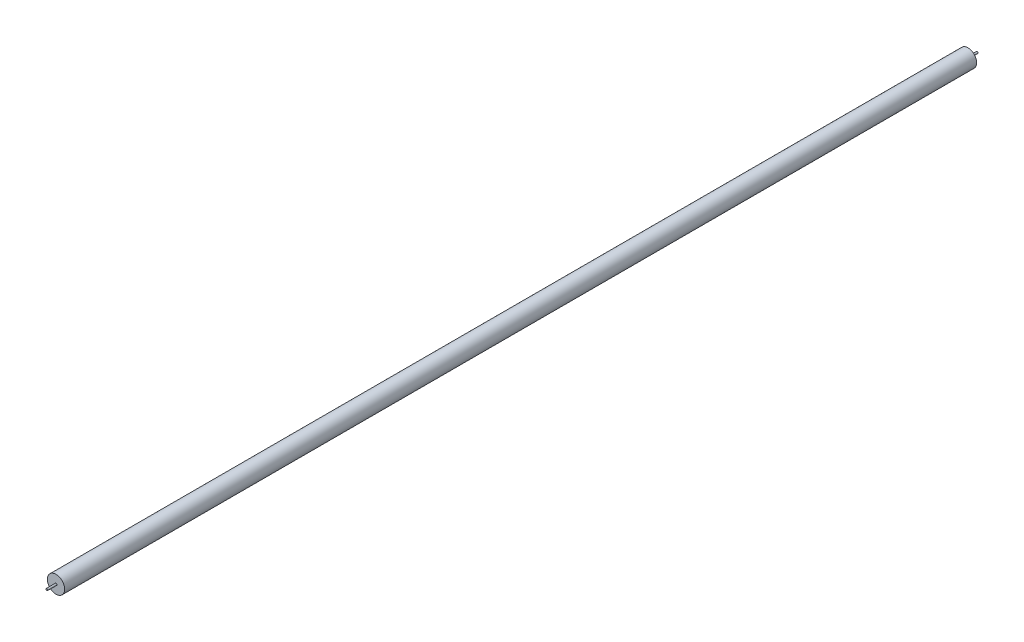
ISO-10303-21;
HEADER;
FILE_DESCRIPTION(('STEP AP214'),'2;1');
FILE_NAME('part.step','',(''),(''),'','','');
FILE_SCHEMA(('AUTOMOTIVE_DESIGN { 1 0 10303 214 1 1 1 1 }'));
ENDSEC;
DATA;
#1=APPLICATION_CONTEXT('core data for automotive mechanical design processes');
#2=APPLICATION_PROTOCOL_DEFINITION('international standard','automotive_design',2000,#1);
#3=PRODUCT_CONTEXT('',#1,'mechanical');
#4=PRODUCT('Part','Part','',(#3));
#5=PRODUCT_RELATED_PRODUCT_CATEGORY('part','',(#4));
#6=PRODUCT_DEFINITION_FORMATION('','',#4);
#7=PRODUCT_DEFINITION_CONTEXT('part definition',#1,'design');
#8=PRODUCT_DEFINITION('design','',#6,#7);
#9=PRODUCT_DEFINITION_SHAPE('','',#8);
#10=(LENGTH_UNIT() NAMED_UNIT(*) SI_UNIT(.MILLI.,.METRE.));
#11=(NAMED_UNIT(*) PLANE_ANGLE_UNIT() SI_UNIT($,.RADIAN.));
#12=(NAMED_UNIT(*) SI_UNIT($,.STERADIAN.) SOLID_ANGLE_UNIT());
#13=UNCERTAINTY_MEASURE_WITH_UNIT(LENGTH_MEASURE(1.E-05),#10,'distance_accuracy_value','');
#14=(GEOMETRIC_REPRESENTATION_CONTEXT(3) GLOBAL_UNCERTAINTY_ASSIGNED_CONTEXT((#13)) GLOBAL_UNIT_ASSIGNED_CONTEXT((#10,
#11,#12)) REPRESENTATION_CONTEXT('',''));
#15=CARTESIAN_POINT('',(0.,0.,0.));
#16=DIRECTION('',(0.,0.,1.));
#17=DIRECTION('',(1.,0.,0.));
#18=AXIS2_PLACEMENT_3D('',#15,#16,#17);
#19=CARTESIAN_POINT('',(0.,-1.12410081243297E-12,501.999999999997));
#20=DIRECTION('',(0.,0.,-0.999999999999988));
#21=DIRECTION('',(-0.999999999999994,0.,0.));
#22=AXIS2_PLACEMENT_3D('',#19,#20,#21);
#23=CYLINDRICAL_SURFACE('',#22,4.75);
#24=CARTESIAN_POINT('',(0.,-1.12410081243297E-12,501.999999999997));
#25=DIRECTION('',(0.,0.,0.999999999999988));
#26=DIRECTION('',(0.999999999999994,0.,0.));
#27=AXIS2_PLACEMENT_3D('',#24,#25,#26);
#28=CIRCLE('',#27,4.75);
#29=CARTESIAN_POINT('',(-4.75000000000002,-1.11777254119261E-12,501.999999999997));
#30=VERTEX_POINT('',#29);
#31=EDGE_CURVE('E45',#30,#30,#28,.T.);
#32=CARTESIAN_POINT('',(0.,0.,0.));
#33=DIRECTION('',(0.,0.,0.999999999999988));
#34=DIRECTION('',(0.999999999999994,0.,0.));
#35=AXIS2_PLACEMENT_3D('',#32,#33,#34);
#36=CIRCLE('',#35,4.75);
#37=CARTESIAN_POINT('',(-4.75000000000002,-1.20273133106126E-12,0.));
#38=VERTEX_POINT('',#37);
#39=EDGE_CURVE('E49',#38,#38,#36,.T.);
#40=CARTESIAN_POINT('',(-4.75000000000002,-1.11777254119261E-12,501.999999999997));
#41=CARTESIAN_POINT('',(-4.75000000000002,-1.11865752858707E-12,496.77083333333));
#42=CARTESIAN_POINT('',(-4.75000000000002,-1.11954251598154E-12,491.541666666664));
#43=CARTESIAN_POINT('',(-4.75000000000002,-1.12131249077047E-12,481.08333333333));
#44=CARTESIAN_POINT('',(-4.75000000000002,-1.12219747816493E-12,475.854166666664));
#45=CARTESIAN_POINT('',(-4.75000000000002,-1.12396745295386E-12,465.39583333333));
#46=CARTESIAN_POINT('',(-4.75000000000002,-1.12485244034833E-12,460.166666666664));
#47=CARTESIAN_POINT('',(-4.75000000000002,-1.12662241513726E-12,449.70833333333));
#48=CARTESIAN_POINT('',(-4.75000000000002,-1.12750740253172E-12,444.479166666664));
#49=CARTESIAN_POINT('',(-4.75000000000002,-1.12927737732065E-12,434.020833333331));
#50=CARTESIAN_POINT('',(-4.75000000000002,-1.13016236471512E-12,428.791666666664));
#51=CARTESIAN_POINT('',(-4.75000000000002,-1.13193233950405E-12,418.333333333331));
#52=CARTESIAN_POINT('',(-4.75000000000002,-1.13281732689851E-12,413.104166666664));
#53=CARTESIAN_POINT('',(-4.75000000000002,-1.13458730168744E-12,402.645833333331));
#54=CARTESIAN_POINT('',(-4.75000000000002,-1.13547228908191E-12,397.416666666664));
#55=CARTESIAN_POINT('',(-4.75000000000002,-1.13724226387084E-12,386.958333333331));
#56=CARTESIAN_POINT('',(-4.75000000000002,-1.1381272512653E-12,381.729166666664));
#57=CARTESIAN_POINT('',(-4.75000000000002,-1.13989722605424E-12,371.270833333331));
#58=CARTESIAN_POINT('',(-4.75000000000002,-1.1407822134487E-12,366.041666666664));
#59=CARTESIAN_POINT('',(-4.75000000000002,-1.14255218823763E-12,355.583333333331));
#60=CARTESIAN_POINT('',(-4.75000000000002,-1.1434371756321E-12,350.354166666664));
#61=CARTESIAN_POINT('',(-4.75000000000002,-1.14520715042103E-12,339.895833333331));
#62=CARTESIAN_POINT('',(-4.75000000000002,-1.14609213781549E-12,334.666666666665));
#63=CARTESIAN_POINT('',(-4.75000000000002,-1.14786211260442E-12,324.208333333331));
#64=CARTESIAN_POINT('',(-4.75000000000002,-1.14874709999889E-12,318.979166666665));
#65=CARTESIAN_POINT('',(-4.75000000000002,-1.15051707478782E-12,308.520833333331));
#66=CARTESIAN_POINT('',(-4.75000000000002,-1.15140206218228E-12,303.291666666665));
#67=CARTESIAN_POINT('',(-4.75000000000002,-1.15317203697121E-12,292.833333333331));
#68=CARTESIAN_POINT('',(-4.75000000000002,-1.15405702436568E-12,287.604166666665));
#69=CARTESIAN_POINT('',(-4.75000000000002,-1.15582699915461E-12,277.145833333332));
#70=CARTESIAN_POINT('',(-4.75000000000002,-1.15671198654907E-12,271.916666666665));
#71=CARTESIAN_POINT('',(-4.75000000000002,-1.158481961338E-12,261.458333333332));
#72=CARTESIAN_POINT('',(-4.75000000000002,-1.15936694873247E-12,256.229166666665));
#73=CARTESIAN_POINT('',(-4.75000000000002,-1.1611369235214E-12,245.770833333332));
#74=CARTESIAN_POINT('',(-4.75000000000002,-1.16202191091586E-12,240.541666666665));
#75=CARTESIAN_POINT('',(-4.75000000000002,-1.16379188570479E-12,230.083333333332));
#76=CARTESIAN_POINT('',(-4.75000000000002,-1.16467687309926E-12,224.854166666665));
#77=CARTESIAN_POINT('',(-4.75000000000002,-1.16644684788819E-12,214.395833333332));
#78=CARTESIAN_POINT('',(-4.75000000000002,-1.16733183528265E-12,209.166666666665));
#79=CARTESIAN_POINT('',(-4.75000000000002,-1.16910181007158E-12,198.708333333332));
#80=CARTESIAN_POINT('',(-4.75000000000002,-1.16998679746605E-12,193.479166666666));
#81=CARTESIAN_POINT('',(-4.75000000000002,-1.17175677225498E-12,183.020833333332));
#82=CARTESIAN_POINT('',(-4.75000000000002,-1.17264175964944E-12,177.791666666666));
#83=CARTESIAN_POINT('',(-4.75000000000002,-1.17441173443837E-12,167.333333333332));
#84=CARTESIAN_POINT('',(-4.75000000000002,-1.17529672183284E-12,162.104166666666));
#85=CARTESIAN_POINT('',(-4.75000000000002,-1.17706669662177E-12,151.645833333332));
#86=CARTESIAN_POINT('',(-4.75000000000002,-1.17795168401624E-12,146.416666666666));
#87=CARTESIAN_POINT('',(-4.75000000000002,-1.17972165880517E-12,135.958333333333));
#88=CARTESIAN_POINT('',(-4.75000000000002,-1.18060664619963E-12,130.729166666666));
#89=CARTESIAN_POINT('',(-4.75000000000002,-1.18237662098856E-12,120.270833333333));
#90=CARTESIAN_POINT('',(-4.75000000000002,-1.18326160838303E-12,115.041666666666));
#91=CARTESIAN_POINT('',(-4.75000000000002,-1.18503158317196E-12,104.583333333333));
#92=CARTESIAN_POINT('',(-4.75000000000002,-1.18591657056642E-12,99.3541666666661));
#93=CARTESIAN_POINT('',(-4.75000000000002,-1.18768654535535E-12,88.8958333333328));
#94=CARTESIAN_POINT('',(-4.75000000000002,-1.18857153274982E-12,83.6666666666662));
#95=CARTESIAN_POINT('',(-4.75000000000002,-1.19034150753875E-12,73.2083333333329));
#96=CARTESIAN_POINT('',(-4.75000000000002,-1.19122649493321E-12,67.9791666666663));
#97=CARTESIAN_POINT('',(-4.75000000000002,-1.19299646972214E-12,57.520833333333));
#98=CARTESIAN_POINT('',(-4.75000000000002,-1.19388145711661E-12,52.2916666666664));
#99=CARTESIAN_POINT('',(-4.75000000000002,-1.19565143190554E-12,41.8333333333332));
#100=CARTESIAN_POINT('',(-4.75000000000002,-1.1965364193E-12,36.6041666666665));
#101=CARTESIAN_POINT('',(-4.75000000000002,-1.19830639408893E-12,26.1458333333332));
#102=CARTESIAN_POINT('',(-4.75000000000002,-1.1991913814834E-12,20.9166666666666));
#103=CARTESIAN_POINT('',(-4.75000000000002,-1.20096135627233E-12,10.4583333333333));
#104=CARTESIAN_POINT('',(-4.75000000000002,-1.20184634366679E-12,5.22916666666667));
#105=CARTESIAN_POINT('',(-4.75000000000002,-1.20273133106126E-12,0.));
#106=B_SPLINE_CURVE_WITH_KNOTS('',3,(#40,#41,#42,#43,#44,#45,#46,#47,#48,#49,#50,#51,#52,#53,
#54,#55,#56,#57,#58,#59,#60,#61,#62,#63,#64,#65,#66,#67,#68,#69,#70,#71,#72,#73,#74,#75,#76,#77,
#78,#79,#80,#81,#82,#83,#84,#85,#86,#87,#88,#89,#90,#91,#92,#93,#94,#95,#96,#97,#98,#99,#100,
#101,#102,#103,#104,#105),.UNSPECIFIED.,.F.,.F.,(4,2,2,2,2,2,2,2,2,2,2,2,2,2,2,2,2,2,2,2,2,2,2,
2,2,2,2,2,2,2,2,2,4),(0.,15.6874999999999,31.3749999999998,47.0624999999997,62.7499999999995,
78.4374999999994,94.1249999999993,109.812499999999,125.499999999999,141.187499999999,
156.874999999999,172.562499999999,188.249999999999,203.937499999999,219.624999999999,
235.312499999998,250.999999999998,266.687499999998,282.374999999998,298.062499999998,
313.749999999998,329.437499999998,345.124999999998,360.812499999998,376.499999999998,
392.187499999997,407.874999999997,423.562499999997,439.249999999997,454.937499999997,
470.624999999997,486.312499999997,501.999999999997),.UNSPECIFIED.);
#107=EDGE_CURVE('BSEAM39',#30,#38,#106,.T.);
#108=ORIENTED_EDGE('',*,*,#31,.F.);
#109=ORIENTED_EDGE('',*,*,#39,.T.);
#110=ORIENTED_EDGE('',*,*,#107,.T.);
#111=ORIENTED_EDGE('',*,*,#107,.F.);
#112=EDGE_LOOP('',(#108,#110,#109,#111));
#113=FACE_BOUND('',#112,.T.);
#114=ADVANCED_FACE('F39',(#113),#23,.T.);
#115=CARTESIAN_POINT('',(0.,-1.12410081243297E-12,501.999999999997));
#116=DIRECTION('',(0.,0.,0.999999999999988));
#117=DIRECTION('',(0.999999999999994,0.,0.));
#118=AXIS2_PLACEMENT_3D('',#115,#116,#117);
#119=PLANE('',#118);
#120=CARTESIAN_POINT('',(0.,-1.12410081243297E-12,501.999999999997));
#121=DIRECTION('',(0.,0.,0.999999999999988));
#122=DIRECTION('',(0.999999999999994,0.,0.));
#123=AXIS2_PLACEMENT_3D('',#120,#121,#122);
#124=CIRCLE('',#123,0.5);
#125=CARTESIAN_POINT('',(-0.500000000002245,6.38198169887899E-13,501.999999999997));
#126=VERTEX_POINT('',#125);
#127=EDGE_CURVE('E59',#126,#126,#124,.T.);
#128=ORIENTED_EDGE('',*,*,#127,.F.);
#129=EDGE_LOOP('',(#128));
#130=FACE_BOUND('',#129,.T.);
#131=ORIENTED_EDGE('',*,*,#31,.T.);
#132=EDGE_LOOP('',(#131));
#133=FACE_BOUND('',#132,.T.);
#134=ADVANCED_FACE('F74',(#130,#133),#119,.T.);
#135=CARTESIAN_POINT('',(0.,0.,0.));
#136=DIRECTION('',(0.,0.,0.999999999999988));
#137=DIRECTION('',(0.999999999999994,0.,0.));
#138=AXIS2_PLACEMENT_3D('',#135,#136,#137);
#139=PLANE('',#138);
#140=CARTESIAN_POINT('',(0.,0.,0.));
#141=DIRECTION('',(0.,0.,0.999999999999988));
#142=DIRECTION('',(0.999999999999994,0.,0.));
#143=AXIS2_PLACEMENT_3D('',#140,#141,#142);
#144=CIRCLE('',#143,0.5);
#145=CARTESIAN_POINT('',(0.499999999999997,0.,0.));
#146=VERTEX_POINT('',#145);
#147=EDGE_CURVE('E10',#146,#146,#144,.F.);
#148=ORIENTED_EDGE('',*,*,#147,.F.);
#149=EDGE_LOOP('',(#148));
#150=FACE_BOUND('',#149,.T.);
#151=ORIENTED_EDGE('',*,*,#39,.F.);
#152=EDGE_LOOP('',(#151));
#153=FACE_BOUND('',#152,.T.);
#154=ADVANCED_FACE('F76',(#150,#153),#139,.F.);
#155=CARTESIAN_POINT('',(0.,0.,-4.99999999999988));
#156=DIRECTION('',(0.,0.,0.999999999999988));
#157=DIRECTION('',(0.999999999999994,0.,0.));
#158=AXIS2_PLACEMENT_3D('',#155,#156,#157);
#159=CYLINDRICAL_SURFACE('',#158,0.5);
#160=CARTESIAN_POINT('',(0.,0.,-4.99999999999988));
#161=DIRECTION('',(0.,0.,-0.999999999999988));
#162=DIRECTION('',(-0.999999999999994,0.,0.));
#163=AXIS2_PLACEMENT_3D('',#160,#161,#162);
#164=CIRCLE('',#163,0.5);
#165=CARTESIAN_POINT('',(0.499999999999997,0.,-4.99999999999988));
#166=VERTEX_POINT('',#165);
#167=EDGE_CURVE('E54',#166,#166,#164,.T.);
#168=CARTESIAN_POINT('',(0.499999999999997,0.,-4.99999999999988));
#169=CARTESIAN_POINT('',(0.499999999999997,0.,-4.94791666666655));
#170=CARTESIAN_POINT('',(0.499999999999997,0.,-4.89583333333321));
#171=CARTESIAN_POINT('',(0.499999999999997,0.,-4.79166666666655));
#172=CARTESIAN_POINT('',(0.499999999999997,0.,-4.73958333333322));
#173=CARTESIAN_POINT('',(0.499999999999997,0.,-4.63541666666655));
#174=CARTESIAN_POINT('',(0.499999999999997,0.,-4.58333333333322));
#175=CARTESIAN_POINT('',(0.499999999999997,0.,-4.47916666666656));
#176=CARTESIAN_POINT('',(0.499999999999997,0.,-4.42708333333323));
#177=CARTESIAN_POINT('',(0.499999999999997,0.,-4.32291666666656));
#178=CARTESIAN_POINT('',(0.499999999999997,0.,-4.27083333333323));
#179=CARTESIAN_POINT('',(0.499999999999997,0.,-4.16666666666657));
#180=CARTESIAN_POINT('',(0.499999999999997,0.,-4.11458333333323));
#181=CARTESIAN_POINT('',(0.499999999999997,0.,-4.01041666666657));
#182=CARTESIAN_POINT('',(0.499999999999997,0.,-3.95833333333324));
#183=CARTESIAN_POINT('',(0.499999999999997,0.,-3.85416666666657));
#184=CARTESIAN_POINT('',(0.499999999999997,0.,-3.80208333333324));
#185=CARTESIAN_POINT('',(0.499999999999997,0.,-3.69791666666658));
#186=CARTESIAN_POINT('',(0.499999999999997,0.,-3.64583333333325));
#187=CARTESIAN_POINT('',(0.499999999999997,0.,-3.54166666666658));
#188=CARTESIAN_POINT('',(0.499999999999997,0.,-3.48958333333325));
#189=CARTESIAN_POINT('',(0.499999999999997,0.,-3.38541666666658));
#190=CARTESIAN_POINT('',(0.499999999999997,0.,-3.33333333333325));
#191=CARTESIAN_POINT('',(0.499999999999997,0.,-3.22916666666659));
#192=CARTESIAN_POINT('',(0.499999999999997,0.,-3.17708333333326));
#193=CARTESIAN_POINT('',(0.499999999999997,0.,-3.07291666666659));
#194=CARTESIAN_POINT('',(0.499999999999997,0.,-3.02083333333326));
#195=CARTESIAN_POINT('',(0.499999999999997,0.,-2.9166666666666));
#196=CARTESIAN_POINT('',(0.499999999999997,0.,-2.86458333333326));
#197=CARTESIAN_POINT('',(0.499999999999997,0.,-2.7604166666666));
#198=CARTESIAN_POINT('',(0.499999999999997,0.,-2.70833333333327));
#199=CARTESIAN_POINT('',(0.499999999999997,0.,-2.6041666666666));
#200=CARTESIAN_POINT('',(0.499999999999997,0.,-2.55208333333327));
#201=CARTESIAN_POINT('',(0.499999999999997,0.,-2.44791666666661));
#202=CARTESIAN_POINT('',(0.499999999999997,0.,-2.39583333333327));
#203=CARTESIAN_POINT('',(0.499999999999997,0.,-2.29166666666661));
#204=CARTESIAN_POINT('',(0.499999999999997,0.,-2.23958333333328));
#205=CARTESIAN_POINT('',(0.499999999999997,0.,-2.13541666666661));
#206=CARTESIAN_POINT('',(0.499999999999997,0.,-2.08333333333328));
#207=CARTESIAN_POINT('',(0.499999999999997,0.,-1.97916666666662));
#208=CARTESIAN_POINT('',(0.499999999999997,0.,-1.92708333333329));
#209=CARTESIAN_POINT('',(0.499999999999997,0.,-1.82291666666662));
#210=CARTESIAN_POINT('',(0.499999999999997,0.,-1.77083333333329));
#211=CARTESIAN_POINT('',(0.499999999999997,0.,-1.66666666666663));
#212=CARTESIAN_POINT('',(0.499999999999997,0.,-1.61458333333329));
#213=CARTESIAN_POINT('',(0.499999999999997,0.,-1.51041666666663));
#214=CARTESIAN_POINT('',(0.499999999999997,0.,-1.4583333333333));
#215=CARTESIAN_POINT('',(0.499999999999997,0.,-1.35416666666663));
#216=CARTESIAN_POINT('',(0.499999999999997,0.,-1.3020833333333));
#217=CARTESIAN_POINT('',(0.499999999999997,0.,-1.19791666666664));
#218=CARTESIAN_POINT('',(0.499999999999997,0.,-1.1458333333333));
#219=CARTESIAN_POINT('',(0.499999999999997,0.,-1.04166666666664));
#220=CARTESIAN_POINT('',(0.499999999999997,0.,-0.989583333333309));
#221=CARTESIAN_POINT('',(0.499999999999997,0.,-0.885416666666644));
#222=CARTESIAN_POINT('',(0.499999999999997,0.,-0.833333333333312));
#223=CARTESIAN_POINT('',(0.499999999999997,0.,-0.729166666666648));
#224=CARTESIAN_POINT('',(0.499999999999997,0.,-0.677083333333315));
#225=CARTESIAN_POINT('',(0.499999999999997,0.,-0.572916666666651));
#226=CARTESIAN_POINT('',(0.499999999999997,0.,-0.520833333333319));
#227=CARTESIAN_POINT('',(0.499999999999997,0.,-0.416666666666655));
#228=CARTESIAN_POINT('',(0.499999999999997,0.,-0.364583333333323));
#229=CARTESIAN_POINT('',(0.499999999999997,0.,-0.260416666666659));
#230=CARTESIAN_POINT('',(0.499999999999997,0.,-0.208333333333327));
#231=CARTESIAN_POINT('',(0.499999999999997,0.,-0.104166666666663));
#232=CARTESIAN_POINT('',(0.499999999999997,0.,-0.052083333333331));
#233=CARTESIAN_POINT('',(0.499999999999997,0.,0.));
#234=B_SPLINE_CURVE_WITH_KNOTS('',3,(#168,#169,#170,#171,#172,#173,#174,#175,#176,#177,#178,
#179,#180,#181,#182,#183,#184,#185,#186,#187,#188,#189,#190,#191,#192,#193,#194,#195,#196,#197,
#198,#199,#200,#201,#202,#203,#204,#205,#206,#207,#208,#209,#210,#211,#212,#213,#214,#215,#216,
#217,#218,#219,#220,#221,#222,#223,#224,#225,#226,#227,#228,#229,#230,#231,#232,#233),
.UNSPECIFIED.,.F.,.F.,(4,2,2,2,2,2,2,2,2,2,2,2,2,2,2,2,2,2,2,2,2,2,2,2,2,2,2,2,2,2,2,2,4),(0.,
0.156249999999996,0.312499999999992,0.468749999999988,0.624999999999984,0.781249999999981,
0.937499999999977,1.09374999999997,1.24999999999997,1.40624999999997,1.56249999999996,
1.71874999999996,1.87499999999995,2.03124999999995,2.18749999999995,2.34374999999994,
2.49999999999994,2.65624999999994,2.81249999999993,2.96874999999993,3.12499999999992,
3.28124999999992,3.43749999999992,3.59374999999991,3.74999999999991,3.90624999999991,
4.0624999999999,4.2187499999999,4.3749999999999,4.53124999999989,4.68749999999989,
4.84374999999988,4.99999999999988),.UNSPECIFIED.);
#235=EDGE_CURVE('BSEAM83',#166,#146,#234,.T.);
#236=ORIENTED_EDGE('',*,*,#167,.F.);
#237=ORIENTED_EDGE('',*,*,#147,.T.);
#238=ORIENTED_EDGE('',*,*,#235,.T.);
#239=ORIENTED_EDGE('',*,*,#235,.F.);
#240=EDGE_LOOP('',(#236,#238,#237,#239));
#241=FACE_BOUND('',#240,.T.);
#242=ADVANCED_FACE('F83',(#241),#159,.T.);
#243=CARTESIAN_POINT('',(0.,0.,-4.99999999999988));
#244=DIRECTION('',(0.,0.,-0.999999999999988));
#245=DIRECTION('',(-0.999999999999994,0.,0.));
#246=AXIS2_PLACEMENT_3D('',#243,#244,#245);
#247=PLANE('',#246);
#248=ORIENTED_EDGE('',*,*,#167,.T.);
#249=EDGE_LOOP('',(#248));
#250=FACE_BOUND('',#249,.T.);
#251=ADVANCED_FACE('F70',(#250),#247,.T.);
#252=CARTESIAN_POINT('',(-2.24820162486594E-12,6.38378239159465E-13,506.999999999996));
#253=DIRECTION('',(0.,0.,-0.999999999999988));
#254=DIRECTION('',(-0.999999999999994,0.,0.));
#255=AXIS2_PLACEMENT_3D('',#252,#253,#254);
#256=CYLINDRICAL_SURFACE('',#255,0.5);
#257=CARTESIAN_POINT('',(-2.24820162486594E-12,6.38378239159465E-13,506.999999999996));
#258=DIRECTION('',(0.,0.,0.999999999999988));
#259=DIRECTION('',(0.999999999999994,0.,0.));
#260=AXIS2_PLACEMENT_3D('',#257,#258,#259);
#261=CIRCLE('',#260,0.5);
#262=CARTESIAN_POINT('',(-0.500000000002245,6.3904437297424E-13,506.999999999996));
#263=VERTEX_POINT('',#262);
#264=EDGE_CURVE('E58',#263,#263,#261,.T.);
#265=CARTESIAN_POINT('',(-0.500000000002245,6.3904437297424E-13,506.999999999996));
#266=CARTESIAN_POINT('',(-0.500000000002245,6.39035558358757E-13,506.947916666663));
#267=CARTESIAN_POINT('',(-0.500000000002245,6.39026743743275E-13,506.895833333329));
#268=CARTESIAN_POINT('',(-0.500000000002245,6.39009114512309E-13,506.791666666663));
#269=CARTESIAN_POINT('',(-0.500000000002245,6.39000299896826E-13,506.739583333329));
#270=CARTESIAN_POINT('',(-0.500000000002245,6.38982670665861E-13,506.635416666663));
#271=CARTESIAN_POINT('',(-0.500000000002245,6.38973856050378E-13,506.583333333329));
#272=CARTESIAN_POINT('',(-0.500000000002245,6.38956226819413E-13,506.479166666663));
#273=CARTESIAN_POINT('',(-0.500000000002245,6.3894741220393E-13,506.427083333329));
#274=CARTESIAN_POINT('',(-0.500000000002245,6.38929782972965E-13,506.322916666663));
#275=CARTESIAN_POINT('',(-0.500000000002245,6.38920968357482E-13,506.270833333329));
#276=CARTESIAN_POINT('',(-0.500000000002245,6.38903339126517E-13,506.166666666663));
#277=CARTESIAN_POINT('',(-0.500000000002245,6.38894524511034E-13,506.114583333329));
#278=CARTESIAN_POINT('',(-0.500000000002245,6.38876895280068E-13,506.010416666663));
#279=CARTESIAN_POINT('',(-0.500000000002245,6.38868080664586E-13,505.958333333329));
#280=CARTESIAN_POINT('',(-0.500000000002245,6.3885045143362E-13,505.854166666663));
#281=CARTESIAN_POINT('',(-0.500000000002245,6.38841636818138E-13,505.802083333329));
#282=CARTESIAN_POINT('',(-0.500000000002245,6.38824007587172E-13,505.697916666663));
#283=CARTESIAN_POINT('',(-0.500000000002245,6.3881519297169E-13,505.645833333329));
#284=CARTESIAN_POINT('',(-0.500000000002245,6.38797563740724E-13,505.541666666663));
#285=CARTESIAN_POINT('',(-0.500000000002245,6.38788749125241E-13,505.48958333333));
#286=CARTESIAN_POINT('',(-0.500000000002245,6.38771119894276E-13,505.385416666663));
#287=CARTESIAN_POINT('',(-0.500000000002245,6.38762305278793E-13,505.33333333333));
#288=CARTESIAN_POINT('',(-0.500000000002245,6.38744676047828E-13,505.229166666663));
#289=CARTESIAN_POINT('',(-0.500000000002245,6.38735861432345E-13,505.17708333333));
#290=CARTESIAN_POINT('',(-0.500000000002245,6.38718232201379E-13,505.072916666663));
#291=CARTESIAN_POINT('',(-0.500000000002245,6.38709417585897E-13,505.02083333333));
#292=CARTESIAN_POINT('',(-0.500000000002245,6.38691788354931E-13,504.916666666663));
#293=CARTESIAN_POINT('',(-0.500000000002245,6.38682973739449E-13,504.86458333333));
#294=CARTESIAN_POINT('',(-0.500000000002245,6.38665344508483E-13,504.760416666663));
#295=CARTESIAN_POINT('',(-0.500000000002245,6.38656529893001E-13,504.70833333333));
#296=CARTESIAN_POINT('',(-0.500000000002245,6.38638900662035E-13,504.604166666663));
#297=CARTESIAN_POINT('',(-0.500000000002245,6.38630086046552E-13,504.55208333333));
#298=CARTESIAN_POINT('',(-0.500000000002245,6.38612456815587E-13,504.447916666663));
#299=CARTESIAN_POINT('',(-0.500000000002245,6.38603642200104E-13,504.39583333333));
#300=CARTESIAN_POINT('',(-0.500000000002245,6.38586012969139E-13,504.291666666663));
#301=CARTESIAN_POINT('',(-0.500000000002245,6.38577198353656E-13,504.23958333333));
#302=CARTESIAN_POINT('',(-0.500000000002245,6.38559569122691E-13,504.135416666663));
#303=CARTESIAN_POINT('',(-0.500000000002245,6.38550754507208E-13,504.08333333333));
#304=CARTESIAN_POINT('',(-0.500000000002245,6.38533125276242E-13,503.979166666663));
#305=CARTESIAN_POINT('',(-0.500000000002245,6.3852431066076E-13,503.92708333333));
#306=CARTESIAN_POINT('',(-0.500000000002245,6.38506681429794E-13,503.822916666663));
#307=CARTESIAN_POINT('',(-0.500000000002245,6.38497866814311E-13,503.77083333333));
#308=CARTESIAN_POINT('',(-0.500000000002245,6.38480237583346E-13,503.666666666663));
#309=CARTESIAN_POINT('',(-0.500000000002245,6.38471422967863E-13,503.61458333333));
#310=CARTESIAN_POINT('',(-0.500000000002245,6.38453793736898E-13,503.510416666663));
#311=CARTESIAN_POINT('',(-0.500000000002245,6.38444979121415E-13,503.45833333333));
#312=CARTESIAN_POINT('',(-0.500000000002245,6.3842734989045E-13,503.354166666663));
#313=CARTESIAN_POINT('',(-0.500000000002245,6.38418535274967E-13,503.30208333333));
#314=CARTESIAN_POINT('',(-0.500000000002245,6.38400906044002E-13,503.197916666663));
#315=CARTESIAN_POINT('',(-0.500000000002245,6.38392091428519E-13,503.14583333333));
#316=CARTESIAN_POINT('',(-0.500000000002245,6.38374462197553E-13,503.041666666663));
#317=CARTESIAN_POINT('',(-0.500000000002245,6.38365647582071E-13,502.98958333333));
#318=CARTESIAN_POINT('',(-0.500000000002245,6.38348018351105E-13,502.885416666663));
#319=CARTESIAN_POINT('',(-0.500000000002245,6.38339203735623E-13,502.83333333333));
#320=CARTESIAN_POINT('',(-0.500000000002245,6.38321574504657E-13,502.729166666663));
#321=CARTESIAN_POINT('',(-0.500000000002245,6.38312759889175E-13,502.67708333333));
#322=CARTESIAN_POINT('',(-0.500000000002245,6.38295130658209E-13,502.572916666664));
#323=CARTESIAN_POINT('',(-0.500000000002245,6.38286316042726E-13,502.52083333333));
#324=CARTESIAN_POINT('',(-0.500000000002245,6.38268686811761E-13,502.416666666664));
#325=CARTESIAN_POINT('',(-0.500000000002245,6.38259872196278E-13,502.36458333333));
#326=CARTESIAN_POINT('',(-0.500000000002245,6.38242242965313E-13,502.260416666664));
#327=CARTESIAN_POINT('',(-0.500000000002245,6.3823342834983E-13,502.20833333333));
#328=CARTESIAN_POINT('',(-0.500000000002245,6.38215799118865E-13,502.104166666663));
#329=CARTESIAN_POINT('',(-0.500000000002245,6.38206984503382E-13,502.05208333333));
#330=CARTESIAN_POINT('',(-0.500000000002245,6.38198169887899E-13,501.999999999997));
#331=B_SPLINE_CURVE_WITH_KNOTS('',3,(#265,#266,#267,#268,#269,#270,#271,#272,#273,#274,#275,
#276,#277,#278,#279,#280,#281,#282,#283,#284,#285,#286,#287,#288,#289,#290,#291,#292,#293,#294,
#295,#296,#297,#298,#299,#300,#301,#302,#303,#304,#305,#306,#307,#308,#309,#310,#311,#312,#313,
#314,#315,#316,#317,#318,#319,#320,#321,#322,#323,#324,#325,#326,#327,#328,#329,#330),
.UNSPECIFIED.,.F.,.F.,(4,2,2,2,2,2,2,2,2,2,2,2,2,2,2,2,2,2,2,2,2,2,2,2,2,2,2,2,2,2,2,2,4),(0.,
0.15625000000008,0.312500000000049,0.468750000000018,0.624999999999987,0.781249999999956,
0.937499999999925,1.09374999999989,1.24999999999986,1.40624999999983,1.5624999999998,
1.71874999999977,1.87499999999974,2.03124999999971,2.18749999999968,2.34374999999964,
2.49999999999961,2.65624999999958,2.81249999999955,2.96874999999952,3.12499999999949,
3.28124999999946,3.43749999999943,3.5937499999994,3.74999999999936,3.90624999999933,
4.0624999999993,4.21874999999927,4.37499999999924,4.53124999999921,4.68749999999918,
4.84374999999915,4.99999999999923),.UNSPECIFIED.);
#332=EDGE_CURVE('BSEAM67',#263,#126,#331,.T.);
#333=ORIENTED_EDGE('',*,*,#264,.F.);
#334=ORIENTED_EDGE('',*,*,#127,.T.);
#335=ORIENTED_EDGE('',*,*,#332,.T.);
#336=ORIENTED_EDGE('',*,*,#332,.F.);
#337=EDGE_LOOP('',(#333,#335,#334,#336));
#338=FACE_BOUND('',#337,.T.);
#339=ADVANCED_FACE('F67',(#338),#256,.T.);
#340=CARTESIAN_POINT('',(-2.24820162486594E-12,6.38378239159465E-13,506.999999999996));
#341=DIRECTION('',(0.,0.,0.999999999999988));
#342=DIRECTION('',(0.999999999999994,0.,0.));
#343=AXIS2_PLACEMENT_3D('',#340,#341,#342);
#344=PLANE('',#343);
#345=ORIENTED_EDGE('',*,*,#264,.T.);
#346=EDGE_LOOP('',(#345));
#347=FACE_BOUND('',#346,.T.);
#348=ADVANCED_FACE('F65',(#347),#344,.T.);
#349=CLOSED_SHELL('',(#114,#134,#154,#242,#251,#339,#348));
#350=MANIFOLD_SOLID_BREP('B2',#349);
#351=ADVANCED_BREP_SHAPE_REPRESENTATION('',(#18,#350),#14);
#352=SHAPE_DEFINITION_REPRESENTATION(#9,#351);
ENDSEC;
END-ISO-10303-21;
